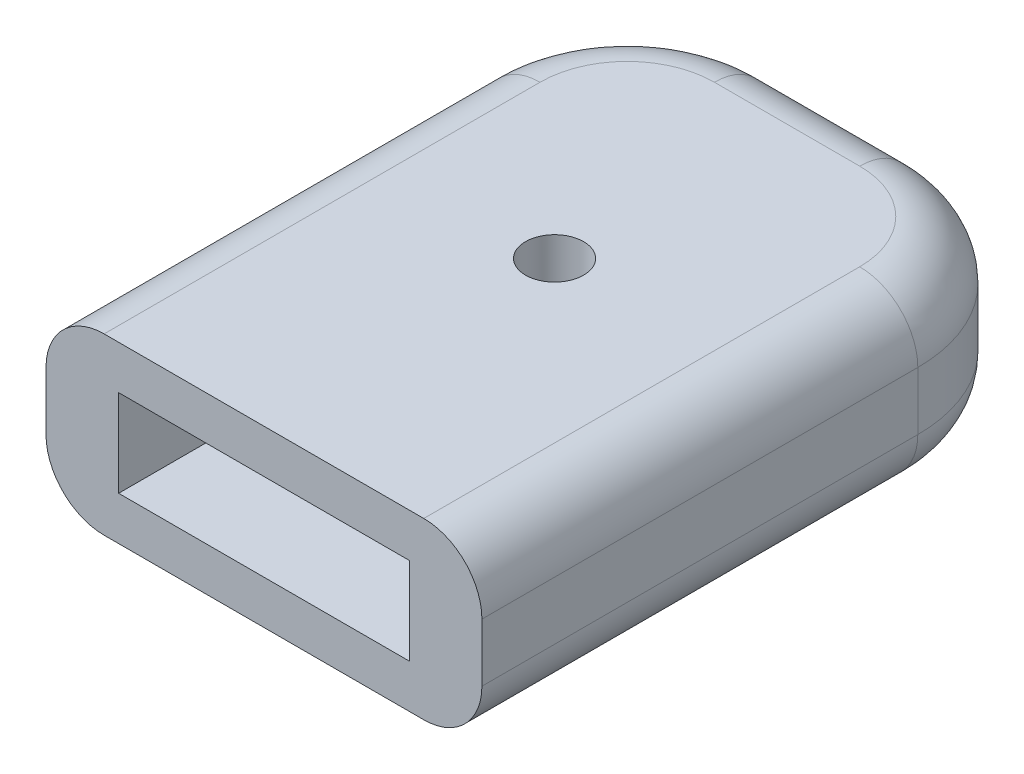
ISO-10303-21;
HEADER;
FILE_DESCRIPTION(('STEP AP214'),'2;1');
FILE_NAME('part.step','',(''),(''),'','','');
FILE_SCHEMA(('AUTOMOTIVE_DESIGN { 1 0 10303 214 1 1 1 1 }'));
ENDSEC;
DATA;
#1=APPLICATION_CONTEXT('core data for automotive mechanical design processes');
#2=APPLICATION_PROTOCOL_DEFINITION('international standard','automotive_design',2000,#1);
#3=PRODUCT_CONTEXT('',#1,'mechanical');
#4=PRODUCT('Part','Part','',(#3));
#5=PRODUCT_RELATED_PRODUCT_CATEGORY('part','',(#4));
#6=PRODUCT_DEFINITION_FORMATION('','',#4);
#7=PRODUCT_DEFINITION_CONTEXT('part definition',#1,'design');
#8=PRODUCT_DEFINITION('design','',#6,#7);
#9=PRODUCT_DEFINITION_SHAPE('','',#8);
#10=(LENGTH_UNIT() NAMED_UNIT(*) SI_UNIT(.MILLI.,.METRE.));
#11=(NAMED_UNIT(*) PLANE_ANGLE_UNIT() SI_UNIT($,.RADIAN.));
#12=(NAMED_UNIT(*) SI_UNIT($,.STERADIAN.) SOLID_ANGLE_UNIT());
#13=UNCERTAINTY_MEASURE_WITH_UNIT(LENGTH_MEASURE(1.E-05),#10,'distance_accuracy_value','');
#14=(GEOMETRIC_REPRESENTATION_CONTEXT(3) GLOBAL_UNCERTAINTY_ASSIGNED_CONTEXT((#13)) GLOBAL_UNIT_ASSIGNED_CONTEXT((#10,
#11,#12)) REPRESENTATION_CONTEXT('',''));
#15=CARTESIAN_POINT('',(0.,0.,0.));
#16=DIRECTION('',(0.,0.,1.));
#17=DIRECTION('',(1.,0.,0.));
#18=AXIS2_PLACEMENT_3D('',#15,#16,#17);
#19=CARTESIAN_POINT('',(-7.5,6.,-9.99999999999999));
#20=DIRECTION('',(1.,0.,0.));
#21=DIRECTION('',(0.,0.,-1.));
#22=AXIS2_PLACEMENT_3D('',#19,#20,#21);
#23=PLANE('',#22);
#24=DIRECTION('',(0.,-1.,0.));
#25=VECTOR('',#24,1.);
#26=CARTESIAN_POINT('',(-7.5,6.,10.));
#27=LINE('',#26,#25);
#28=CARTESIAN_POINT('',(-7.5,4.,10.));
#29=VERTEX_POINT('',#28);
#30=CARTESIAN_POINT('',(-7.5,2.,10.));
#31=VERTEX_POINT('',#30);
#32=EDGE_CURVE('E208',#29,#31,#27,.T.);
#33=ORIENTED_EDGE('',*,*,#32,.F.);
#34=DIRECTION('',(0.,0.,1.));
#35=VECTOR('',#34,1.);
#36=CARTESIAN_POINT('',(-7.5,4.,-9.99999999999999));
#37=LINE('',#36,#35);
#38=CARTESIAN_POINT('',(-7.5,4.,-4.99999999999999));
#39=VERTEX_POINT('',#38);
#40=EDGE_CURVE('E253',#29,#39,#37,.F.);
#41=ORIENTED_EDGE('',*,*,#40,.T.);
#42=DIRECTION('',(0.,-1.,0.));
#43=VECTOR('',#42,1.);
#44=CARTESIAN_POINT('',(-7.5,6.,-4.99999999999999));
#45=LINE('',#44,#43);
#46=CARTESIAN_POINT('',(-7.5,2.,-4.99999999999999));
#47=VERTEX_POINT('',#46);
#48=EDGE_CURVE('E217',#39,#47,#45,.T.);
#49=ORIENTED_EDGE('',*,*,#48,.T.);
#50=DIRECTION('',(0.,0.,1.));
#51=VECTOR('',#50,1.);
#52=CARTESIAN_POINT('',(-7.5,2.,10.));
#53=LINE('',#52,#51);
#54=EDGE_CURVE('E251',#47,#31,#53,.T.);
#55=ORIENTED_EDGE('',*,*,#54,.T.);
#56=EDGE_LOOP('',(#33,#41,#49,#55));
#57=FACE_BOUND('',#56,.T.);
#58=ADVANCED_FACE('F39',(#57),#23,.F.);
#59=CARTESIAN_POINT('',(7.5,6.,10.));
#60=DIRECTION('',(0.,0.,-1.));
#61=DIRECTION('',(-1.,0.,0.));
#62=AXIS2_PLACEMENT_3D('',#59,#60,#61);
#63=PLANE('',#62);
#64=DIRECTION('',(1.,0.,0.));
#65=VECTOR('',#64,1.);
#66=CARTESIAN_POINT('',(5.00000000000001,1.5,10.));
#67=LINE('',#66,#65);
#68=CARTESIAN_POINT('',(-4.99999999999999,1.5,10.));
#69=VERTEX_POINT('',#68);
#70=CARTESIAN_POINT('',(5.00000000000001,1.5,10.));
#71=VERTEX_POINT('',#70);
#72=EDGE_CURVE('E189',#69,#71,#67,.T.);
#73=ORIENTED_EDGE('',*,*,#72,.F.);
#74=DIRECTION('',(0.,-1.,0.));
#75=VECTOR('',#74,1.);
#76=CARTESIAN_POINT('',(-4.99999999999999,4.5,10.));
#77=LINE('',#76,#75);
#78=CARTESIAN_POINT('',(-4.99999999999999,4.5,10.));
#79=VERTEX_POINT('',#78);
#80=EDGE_CURVE('E160',#79,#69,#77,.T.);
#81=ORIENTED_EDGE('',*,*,#80,.F.);
#82=DIRECTION('',(-1.,0.,0.));
#83=VECTOR('',#82,1.);
#84=CARTESIAN_POINT('',(5.00000000000001,4.5,10.));
#85=LINE('',#84,#83);
#86=CARTESIAN_POINT('',(5.00000000000001,4.5,10.));
#87=VERTEX_POINT('',#86);
#88=EDGE_CURVE('E177',#87,#79,#85,.T.);
#89=ORIENTED_EDGE('',*,*,#88,.F.);
#90=DIRECTION('',(0.,1.,0.));
#91=VECTOR('',#90,1.);
#92=CARTESIAN_POINT('',(5.00000000000001,4.5,10.));
#93=LINE('',#92,#91);
#94=EDGE_CURVE('E180',#71,#87,#93,.T.);
#95=ORIENTED_EDGE('',*,*,#94,.F.);
#96=EDGE_LOOP('',(#73,#81,#89,#95));
#97=FACE_BOUND('',#96,.T.);
#98=DIRECTION('',(0.,-1.,0.));
#99=VECTOR('',#98,1.);
#100=CARTESIAN_POINT('',(7.5,6.,10.));
#101=LINE('',#100,#99);
#102=CARTESIAN_POINT('',(7.5,4.,10.));
#103=VERTEX_POINT('',#102);
#104=CARTESIAN_POINT('',(7.5,2.,10.));
#105=VERTEX_POINT('',#104);
#106=EDGE_CURVE('E203',#103,#105,#101,.T.);
#107=ORIENTED_EDGE('',*,*,#106,.F.);
#108=CARTESIAN_POINT('',(5.5,4.,10.));
#109=DIRECTION('',(0.,0.,-1.));
#110=DIRECTION('',(-1.,0.,0.));
#111=AXIS2_PLACEMENT_3D('',#108,#109,#110);
#112=CIRCLE('',#111,2.);
#113=CARTESIAN_POINT('',(5.5,6.,10.));
#114=VERTEX_POINT('',#113);
#115=EDGE_CURVE('E245',#103,#114,#112,.F.);
#116=ORIENTED_EDGE('',*,*,#115,.T.);
#117=DIRECTION('',(1.,0.,0.));
#118=VECTOR('',#117,1.);
#119=CARTESIAN_POINT('',(7.5,6.,10.));
#120=LINE('',#119,#118);
#121=CARTESIAN_POINT('',(-5.49999999999999,6.,10.));
#122=VERTEX_POINT('',#121);
#123=EDGE_CURVE('E200',#122,#114,#120,.T.);
#124=ORIENTED_EDGE('',*,*,#123,.F.);
#125=CARTESIAN_POINT('',(-5.5,4.,10.));
#126=DIRECTION('',(0.,0.,-1.));
#127=DIRECTION('',(-1.,0.,0.));
#128=AXIS2_PLACEMENT_3D('',#125,#126,#127);
#129=CIRCLE('',#128,2.);
#130=EDGE_CURVE('E243',#122,#29,#129,.F.);
#131=ORIENTED_EDGE('',*,*,#130,.T.);
#132=ORIENTED_EDGE('',*,*,#32,.T.);
#133=CARTESIAN_POINT('',(-5.5,2.,10.));
#134=DIRECTION('',(0.,0.,-1.));
#135=DIRECTION('',(-1.,0.,0.));
#136=AXIS2_PLACEMENT_3D('',#133,#134,#135);
#137=CIRCLE('',#136,2.);
#138=CARTESIAN_POINT('',(-5.49999999999999,0.,10.));
#139=VERTEX_POINT('',#138);
#140=EDGE_CURVE('E239',#31,#139,#137,.F.);
#141=ORIENTED_EDGE('',*,*,#140,.T.);
#142=DIRECTION('',(1.,0.,0.));
#143=VECTOR('',#142,1.);
#144=CARTESIAN_POINT('',(7.5,0.,10.));
#145=LINE('',#144,#143);
#146=CARTESIAN_POINT('',(5.5,0.,10.));
#147=VERTEX_POINT('',#146);
#148=EDGE_CURVE('E196',#139,#147,#145,.T.);
#149=ORIENTED_EDGE('',*,*,#148,.T.);
#150=CARTESIAN_POINT('',(5.5,2.,10.));
#151=DIRECTION('',(0.,0.,-1.));
#152=DIRECTION('',(-1.,0.,0.));
#153=AXIS2_PLACEMENT_3D('',#150,#151,#152);
#154=CIRCLE('',#153,2.);
#155=EDGE_CURVE('E241',#147,#105,#154,.F.);
#156=ORIENTED_EDGE('',*,*,#155,.T.);
#157=EDGE_LOOP('',(#107,#116,#124,#131,#132,#141,#149,#156));
#158=FACE_BOUND('',#157,.T.);
#159=ADVANCED_FACE('F301',(#97,#158),#63,.F.);
#160=CARTESIAN_POINT('',(7.5,6.,-9.99999999999999));
#161=DIRECTION('',(-1.,0.,0.));
#162=DIRECTION('',(0.,0.,1.));
#163=AXIS2_PLACEMENT_3D('',#160,#161,#162);
#164=PLANE('',#163);
#165=DIRECTION('',(0.,-1.,0.));
#166=VECTOR('',#165,1.);
#167=CARTESIAN_POINT('',(7.5,6.,-4.99999999999999));
#168=LINE('',#167,#166);
#169=CARTESIAN_POINT('',(7.5,2.,-4.99999999999999));
#170=VERTEX_POINT('',#169);
#171=CARTESIAN_POINT('',(7.5,4.,-4.99999999999999));
#172=VERTEX_POINT('',#171);
#173=EDGE_CURVE('E214',#170,#172,#168,.F.);
#174=ORIENTED_EDGE('',*,*,#173,.T.);
#175=DIRECTION('',(0.,0.,-1.));
#176=VECTOR('',#175,1.);
#177=CARTESIAN_POINT('',(7.5,4.,-9.99999999999999));
#178=LINE('',#177,#176);
#179=EDGE_CURVE('E237',#172,#103,#178,.F.);
#180=ORIENTED_EDGE('',*,*,#179,.T.);
#181=ORIENTED_EDGE('',*,*,#106,.T.);
#182=DIRECTION('',(0.,0.,-1.));
#183=VECTOR('',#182,1.);
#184=CARTESIAN_POINT('',(7.5,2.,-4.99999999999999));
#185=LINE('',#184,#183);
#186=EDGE_CURVE('E234',#105,#170,#185,.T.);
#187=ORIENTED_EDGE('',*,*,#186,.T.);
#188=EDGE_LOOP('',(#174,#180,#181,#187));
#189=FACE_BOUND('',#188,.T.);
#190=ADVANCED_FACE('F335',(#189),#164,.F.);
#191=CARTESIAN_POINT('',(7.5,6.,-9.99999999999999));
#192=DIRECTION('',(0.,0.,1.));
#193=DIRECTION('',(1.,0.,0.));
#194=AXIS2_PLACEMENT_3D('',#191,#192,#193);
#195=PLANE('',#194);
#196=DIRECTION('',(0.,-1.,0.));
#197=VECTOR('',#196,1.);
#198=CARTESIAN_POINT('',(-2.5,6.,-9.99999999999999));
#199=LINE('',#198,#197);
#200=CARTESIAN_POINT('',(-2.5,2.,-9.99999999999999));
#201=VERTEX_POINT('',#200);
#202=CARTESIAN_POINT('',(-2.5,4.,-9.99999999999999));
#203=VERTEX_POINT('',#202);
#204=EDGE_CURVE('E220',#201,#203,#199,.F.);
#205=ORIENTED_EDGE('',*,*,#204,.T.);
#206=DIRECTION('',(-1.,0.,0.));
#207=VECTOR('',#206,1.);
#208=CARTESIAN_POINT('',(7.5,4.,-9.99999999999999));
#209=LINE('',#208,#207);
#210=CARTESIAN_POINT('',(2.5,4.,-9.99999999999999));
#211=VERTEX_POINT('',#210);
#212=EDGE_CURVE('E11',#203,#211,#209,.F.);
#213=ORIENTED_EDGE('',*,*,#212,.T.);
#214=DIRECTION('',(0.,-1.,0.));
#215=VECTOR('',#214,1.);
#216=CARTESIAN_POINT('',(2.5,6.,-9.99999999999999));
#217=LINE('',#216,#215);
#218=CARTESIAN_POINT('',(2.5,2.,-9.99999999999999));
#219=VERTEX_POINT('',#218);
#220=EDGE_CURVE('E211',#211,#219,#217,.T.);
#221=ORIENTED_EDGE('',*,*,#220,.T.);
#222=DIRECTION('',(-1.,0.,0.));
#223=VECTOR('',#222,1.);
#224=CARTESIAN_POINT('',(-2.5,2.,-9.99999999999999));
#225=LINE('',#224,#223);
#226=EDGE_CURVE('E48',#219,#201,#225,.T.);
#227=ORIENTED_EDGE('',*,*,#226,.T.);
#228=EDGE_LOOP('',(#205,#213,#221,#227));
#229=FACE_BOUND('',#228,.T.);
#230=ADVANCED_FACE('F314',(#229),#195,.F.);
#231=CARTESIAN_POINT('',(0.,6.,0.));
#232=DIRECTION('',(0.,-1.,0.));
#233=DIRECTION('',(0.,0.,-1.));
#234=AXIS2_PLACEMENT_3D('',#231,#232,#233);
#235=PLANE('',#234);
#236=CARTESIAN_POINT('',(0.,6.,0.));
#237=DIRECTION('',(0.,-1.,0.));
#238=DIRECTION('',(0.,0.,-1.));
#239=AXIS2_PLACEMENT_3D('',#236,#237,#238);
#240=CIRCLE('',#239,1.);
#241=CARTESIAN_POINT('',(0.,6.,-1.));
#242=VERTEX_POINT('',#241);
#243=EDGE_CURVE('E183',#242,#242,#240,.T.);
#244=ORIENTED_EDGE('',*,*,#243,.T.);
#245=EDGE_LOOP('',(#244));
#246=FACE_BOUND('',#245,.T.);
#247=ORIENTED_EDGE('',*,*,#123,.T.);
#248=DIRECTION('',(0.,0.,-1.));
#249=VECTOR('',#248,1.);
#250=CARTESIAN_POINT('',(5.5,6.,0.));
#251=LINE('',#250,#249);
#252=CARTESIAN_POINT('',(5.5,6.,-4.99999999999999));
#253=VERTEX_POINT('',#252);
#254=EDGE_CURVE('E231',#114,#253,#251,.T.);
#255=ORIENTED_EDGE('',*,*,#254,.T.);
#256=CARTESIAN_POINT('',(2.5,6.,-4.99999999999999));
#257=DIRECTION('',(0.,-1.,0.));
#258=DIRECTION('',(0.,0.,-1.));
#259=AXIS2_PLACEMENT_3D('',#256,#257,#258);
#260=CIRCLE('',#259,3.);
#261=CARTESIAN_POINT('',(2.5,6.,-7.99999999999999));
#262=VERTEX_POINT('',#261);
#263=EDGE_CURVE('E229',#253,#262,#260,.F.);
#264=ORIENTED_EDGE('',*,*,#263,.T.);
#265=DIRECTION('',(-1.,0.,0.));
#266=VECTOR('',#265,1.);
#267=CARTESIAN_POINT('',(0.,6.,-7.99999999999999));
#268=LINE('',#267,#266);
#269=CARTESIAN_POINT('',(-2.5,6.,-7.99999999999999));
#270=VERTEX_POINT('',#269);
#271=EDGE_CURVE('E223',#262,#270,#268,.T.);
#272=ORIENTED_EDGE('',*,*,#271,.T.);
#273=CARTESIAN_POINT('',(-2.5,6.,-4.99999999999999));
#274=DIRECTION('',(0.,-1.,0.));
#275=DIRECTION('',(0.,0.,-1.));
#276=AXIS2_PLACEMENT_3D('',#273,#274,#275);
#277=CIRCLE('',#276,3.);
#278=CARTESIAN_POINT('',(-5.5,6.,-4.99999999999999));
#279=VERTEX_POINT('',#278);
#280=EDGE_CURVE('E225',#270,#279,#277,.F.);
#281=ORIENTED_EDGE('',*,*,#280,.T.);
#282=DIRECTION('',(0.,0.,1.));
#283=VECTOR('',#282,1.);
#284=CARTESIAN_POINT('',(-5.5,6.,0.));
#285=LINE('',#284,#283);
#286=EDGE_CURVE('E227',#279,#122,#285,.T.);
#287=ORIENTED_EDGE('',*,*,#286,.T.);
#288=EDGE_LOOP('',(#247,#255,#264,#272,#281,#287));
#289=FACE_BOUND('',#288,.T.);
#290=ADVANCED_FACE('F342',(#246,#289),#235,.F.);
#291=CARTESIAN_POINT('',(0.,0.,0.));
#292=DIRECTION('',(0.,-1.,0.));
#293=DIRECTION('',(0.,0.,-1.));
#294=AXIS2_PLACEMENT_3D('',#291,#292,#293);
#295=PLANE('',#294);
#296=CARTESIAN_POINT('',(0.,0.,0.));
#297=DIRECTION('',(0.,-1.,0.));
#298=DIRECTION('',(0.,0.,-1.));
#299=AXIS2_PLACEMENT_3D('',#296,#297,#298);
#300=CIRCLE('',#299,1.);
#301=CARTESIAN_POINT('',(0.,0.,-1.));
#302=VERTEX_POINT('',#301);
#303=EDGE_CURVE('E624',#302,#302,#300,.T.);
#304=ORIENTED_EDGE('',*,*,#303,.F.);
#305=EDGE_LOOP('',(#304));
#306=FACE_BOUND('',#305,.T.);
#307=CARTESIAN_POINT('',(2.5,0.,-4.99999999999999));
#308=DIRECTION('',(0.,-1.,0.));
#309=DIRECTION('',(0.,0.,-1.));
#310=AXIS2_PLACEMENT_3D('',#307,#308,#309);
#311=CIRCLE('',#310,3.);
#312=CARTESIAN_POINT('',(2.5,0.,-7.99999999999999));
#313=VERTEX_POINT('',#312);
#314=CARTESIAN_POINT('',(5.5,0.,-4.99999999999999));
#315=VERTEX_POINT('',#314);
#316=EDGE_CURVE('E56',#313,#315,#311,.T.);
#317=ORIENTED_EDGE('',*,*,#316,.T.);
#318=DIRECTION('',(0.,0.,-1.));
#319=VECTOR('',#318,1.);
#320=CARTESIAN_POINT('',(5.5,0.,10.));
#321=LINE('',#320,#319);
#322=EDGE_CURVE('E265',#315,#147,#321,.F.);
#323=ORIENTED_EDGE('',*,*,#322,.T.);
#324=ORIENTED_EDGE('',*,*,#148,.F.);
#325=DIRECTION('',(0.,0.,1.));
#326=VECTOR('',#325,1.);
#327=CARTESIAN_POINT('',(-5.5,0.,-4.99999999999999));
#328=LINE('',#327,#326);
#329=CARTESIAN_POINT('',(-5.5,0.,-4.99999999999999));
#330=VERTEX_POINT('',#329);
#331=EDGE_CURVE('E63',#139,#330,#328,.F.);
#332=ORIENTED_EDGE('',*,*,#331,.T.);
#333=CARTESIAN_POINT('',(-2.5,0.,-4.99999999999999));
#334=DIRECTION('',(0.,-1.,0.));
#335=DIRECTION('',(0.,0.,-1.));
#336=AXIS2_PLACEMENT_3D('',#333,#334,#335);
#337=CIRCLE('',#336,3.);
#338=CARTESIAN_POINT('',(-2.5,0.,-7.99999999999999));
#339=VERTEX_POINT('',#338);
#340=EDGE_CURVE('E261',#330,#339,#337,.T.);
#341=ORIENTED_EDGE('',*,*,#340,.T.);
#342=DIRECTION('',(-1.,0.,0.));
#343=VECTOR('',#342,1.);
#344=CARTESIAN_POINT('',(2.5,0.,-7.99999999999999));
#345=LINE('',#344,#343);
#346=EDGE_CURVE('E259',#339,#313,#345,.F.);
#347=ORIENTED_EDGE('',*,*,#346,.T.);
#348=EDGE_LOOP('',(#317,#323,#324,#332,#341,#347));
#349=FACE_BOUND('',#348,.T.);
#350=ADVANCED_FACE('F344',(#306,#349),#295,.T.);
#351=CARTESIAN_POINT('',(-4.99999999999999,4.5,-5.99999999999999));
#352=DIRECTION('',(-1.,0.,0.));
#353=DIRECTION('',(0.,-1.,0.));
#354=AXIS2_PLACEMENT_3D('',#351,#352,#353);
#355=PLANE('',#354);
#356=ORIENTED_EDGE('',*,*,#80,.T.);
#357=DIRECTION('',(0.,0.,1.));
#358=VECTOR('',#357,1.);
#359=CARTESIAN_POINT('',(-4.99999999999999,1.5,-5.99999999999999));
#360=LINE('',#359,#358);
#361=CARTESIAN_POINT('',(-4.99999999999999,1.5,-5.99999999999999));
#362=VERTEX_POINT('',#361);
#363=EDGE_CURVE('E153',#362,#69,#360,.T.);
#364=ORIENTED_EDGE('',*,*,#363,.F.);
#365=DIRECTION('',(0.,-1.,0.));
#366=VECTOR('',#365,1.);
#367=CARTESIAN_POINT('',(-4.99999999999999,4.5,-5.99999999999999));
#368=LINE('',#367,#366);
#369=CARTESIAN_POINT('',(-4.99999999999999,4.5,-5.99999999999999));
#370=VERTEX_POINT('',#369);
#371=EDGE_CURVE('E157',#370,#362,#368,.T.);
#372=ORIENTED_EDGE('',*,*,#371,.F.);
#373=DIRECTION('',(0.,0.,1.));
#374=VECTOR('',#373,1.);
#375=CARTESIAN_POINT('',(-4.99999999999999,4.5,-5.99999999999999));
#376=LINE('',#375,#374);
#377=EDGE_CURVE('E194',#370,#79,#376,.T.);
#378=ORIENTED_EDGE('',*,*,#377,.T.);
#379=EDGE_LOOP('',(#356,#364,#372,#378));
#380=FACE_BOUND('',#379,.T.);
#381=ADVANCED_FACE('F155',(#380),#355,.F.);
#382=CARTESIAN_POINT('',(5.00000000000001,4.5,-5.99999999999999));
#383=DIRECTION('',(0.,1.,0.));
#384=DIRECTION('',(-1.,0.,0.));
#385=AXIS2_PLACEMENT_3D('',#382,#383,#384);
#386=PLANE('',#385);
#387=CARTESIAN_POINT('',(0.,4.5,0.));
#388=DIRECTION('',(0.,1.,0.));
#389=DIRECTION('',(-1.,0.,0.));
#390=AXIS2_PLACEMENT_3D('',#387,#388,#389);
#391=CIRCLE('',#390,1.);
#392=CARTESIAN_POINT('',(-1.,4.5,0.));
#393=VERTEX_POINT('',#392);
#394=EDGE_CURVE('E621',#393,#393,#391,.T.);
#395=ORIENTED_EDGE('',*,*,#394,.T.);
#396=EDGE_LOOP('',(#395));
#397=FACE_BOUND('',#396,.T.);
#398=ORIENTED_EDGE('',*,*,#88,.T.);
#399=ORIENTED_EDGE('',*,*,#377,.F.);
#400=DIRECTION('',(-1.,0.,0.));
#401=VECTOR('',#400,1.);
#402=CARTESIAN_POINT('',(5.00000000000001,4.5,-5.99999999999999));
#403=LINE('',#402,#401);
#404=CARTESIAN_POINT('',(5.00000000000001,4.5,-5.99999999999999));
#405=VERTEX_POINT('',#404);
#406=EDGE_CURVE('E165',#405,#370,#403,.T.);
#407=ORIENTED_EDGE('',*,*,#406,.F.);
#408=DIRECTION('',(0.,0.,1.));
#409=VECTOR('',#408,1.);
#410=CARTESIAN_POINT('',(5.00000000000001,4.5,-5.99999999999999));
#411=LINE('',#410,#409);
#412=EDGE_CURVE('E197',#405,#87,#411,.T.);
#413=ORIENTED_EDGE('',*,*,#412,.T.);
#414=EDGE_LOOP('',(#398,#399,#407,#413));
#415=FACE_BOUND('',#414,.T.);
#416=ADVANCED_FACE('F453',(#397,#415),#386,.F.);
#417=CARTESIAN_POINT('',(5.00000000000001,4.5,-5.99999999999999));
#418=DIRECTION('',(1.,0.,0.));
#419=DIRECTION('',(0.,0.,-1.));
#420=AXIS2_PLACEMENT_3D('',#417,#418,#419);
#421=PLANE('',#420);
#422=ORIENTED_EDGE('',*,*,#94,.T.);
#423=ORIENTED_EDGE('',*,*,#412,.F.);
#424=DIRECTION('',(0.,1.,0.));
#425=VECTOR('',#424,1.);
#426=CARTESIAN_POINT('',(5.00000000000001,4.5,-5.99999999999999));
#427=LINE('',#426,#425);
#428=CARTESIAN_POINT('',(5.00000000000001,1.5,-5.99999999999999));
#429=VERTEX_POINT('',#428);
#430=EDGE_CURVE('E173',#429,#405,#427,.T.);
#431=ORIENTED_EDGE('',*,*,#430,.F.);
#432=DIRECTION('',(0.,0.,1.));
#433=VECTOR('',#432,1.);
#434=CARTESIAN_POINT('',(5.00000000000001,1.5,-5.99999999999999));
#435=LINE('',#434,#433);
#436=EDGE_CURVE('E164',#429,#71,#435,.T.);
#437=ORIENTED_EDGE('',*,*,#436,.T.);
#438=EDGE_LOOP('',(#422,#423,#431,#437));
#439=FACE_BOUND('',#438,.T.);
#440=ADVANCED_FACE('F441',(#439),#421,.F.);
#441=CARTESIAN_POINT('',(5.00000000000001,1.5,-5.99999999999999));
#442=DIRECTION('',(0.,-1.,0.));
#443=DIRECTION('',(1.,0.,0.));
#444=AXIS2_PLACEMENT_3D('',#441,#442,#443);
#445=PLANE('',#444);
#446=CARTESIAN_POINT('',(0.,1.5,0.));
#447=DIRECTION('',(0.,-1.,0.));
#448=DIRECTION('',(1.,0.,0.));
#449=AXIS2_PLACEMENT_3D('',#446,#447,#448);
#450=CIRCLE('',#449,1.);
#451=CARTESIAN_POINT('',(1.,1.5,0.));
#452=VERTEX_POINT('',#451);
#453=EDGE_CURVE('E43',#452,#452,#450,.T.);
#454=ORIENTED_EDGE('',*,*,#453,.T.);
#455=EDGE_LOOP('',(#454));
#456=FACE_BOUND('',#455,.T.);
#457=ORIENTED_EDGE('',*,*,#72,.T.);
#458=ORIENTED_EDGE('',*,*,#436,.F.);
#459=DIRECTION('',(1.,0.,0.));
#460=VECTOR('',#459,1.);
#461=CARTESIAN_POINT('',(5.00000000000001,1.5,-5.99999999999999));
#462=LINE('',#461,#460);
#463=EDGE_CURVE('E168',#362,#429,#462,.T.);
#464=ORIENTED_EDGE('',*,*,#463,.F.);
#465=ORIENTED_EDGE('',*,*,#363,.T.);
#466=EDGE_LOOP('',(#457,#458,#464,#465));
#467=FACE_BOUND('',#466,.T.);
#468=ADVANCED_FACE('F169',(#456,#467),#445,.F.);
#469=CARTESIAN_POINT('',(0.,0.,-5.99999999999999));
#470=DIRECTION('',(0.,0.,-1.));
#471=DIRECTION('',(-1.,0.,0.));
#472=AXIS2_PLACEMENT_3D('',#469,#470,#471);
#473=PLANE('',#472);
#474=ORIENTED_EDGE('',*,*,#371,.T.);
#475=ORIENTED_EDGE('',*,*,#463,.T.);
#476=ORIENTED_EDGE('',*,*,#430,.T.);
#477=ORIENTED_EDGE('',*,*,#406,.T.);
#478=EDGE_LOOP('',(#474,#475,#476,#477));
#479=FACE_BOUND('',#478,.T.);
#480=ADVANCED_FACE('F175',(#479),#473,.F.);
#481=CARTESIAN_POINT('',(2.5,6.,-4.99999999999999));
#482=DIRECTION('',(0.,-1.,0.));
#483=DIRECTION('',(0.,0.,-1.));
#484=AXIS2_PLACEMENT_3D('',#481,#482,#483);
#485=CYLINDRICAL_SURFACE('',#484,5.);
#486=ORIENTED_EDGE('',*,*,#220,.F.);
#487=CARTESIAN_POINT('',(2.5,4.,-4.99999999999999));
#488=DIRECTION('',(0.,-1.,0.));
#489=DIRECTION('',(0.,0.,-1.));
#490=AXIS2_PLACEMENT_3D('',#487,#488,#489);
#491=CIRCLE('',#490,5.);
#492=EDGE_CURVE('E249',#211,#172,#491,.T.);
#493=ORIENTED_EDGE('',*,*,#492,.T.);
#494=ORIENTED_EDGE('',*,*,#173,.F.);
#495=CARTESIAN_POINT('',(2.5,2.,-4.99999999999999));
#496=DIRECTION('',(0.,-1.,0.));
#497=DIRECTION('',(0.,0.,-1.));
#498=AXIS2_PLACEMENT_3D('',#495,#496,#497);
#499=CIRCLE('',#498,5.);
#500=EDGE_CURVE('E247',#170,#219,#499,.F.);
#501=ORIENTED_EDGE('',*,*,#500,.T.);
#502=EDGE_LOOP('',(#486,#493,#494,#501));
#503=FACE_BOUND('',#502,.T.);
#504=ADVANCED_FACE('F332',(#503),#485,.T.);
#505=CARTESIAN_POINT('',(-2.5,6.,-4.99999999999999));
#506=DIRECTION('',(0.,-1.,0.));
#507=DIRECTION('',(0.,0.,-1.));
#508=AXIS2_PLACEMENT_3D('',#505,#506,#507);
#509=CYLINDRICAL_SURFACE('',#508,5.);
#510=ORIENTED_EDGE('',*,*,#48,.F.);
#511=CARTESIAN_POINT('',(-2.5,4.,-4.99999999999999));
#512=DIRECTION('',(0.,-1.,0.));
#513=DIRECTION('',(0.,0.,-1.));
#514=AXIS2_PLACEMENT_3D('',#511,#512,#513);
#515=CIRCLE('',#514,5.);
#516=EDGE_CURVE('E257',#39,#203,#515,.T.);
#517=ORIENTED_EDGE('',*,*,#516,.T.);
#518=ORIENTED_EDGE('',*,*,#204,.F.);
#519=CARTESIAN_POINT('',(-2.5,2.,-4.99999999999999));
#520=DIRECTION('',(0.,-1.,0.));
#521=DIRECTION('',(0.,0.,-1.));
#522=AXIS2_PLACEMENT_3D('',#519,#520,#521);
#523=CIRCLE('',#522,5.);
#524=EDGE_CURVE('E255',#201,#47,#523,.F.);
#525=ORIENTED_EDGE('',*,*,#524,.T.);
#526=EDGE_LOOP('',(#510,#517,#518,#525));
#527=FACE_BOUND('',#526,.T.);
#528=ADVANCED_FACE('F310',(#527),#509,.T.);
#529=CARTESIAN_POINT('',(-5.5,4.,0.));
#530=DIRECTION('',(0.,0.,1.));
#531=DIRECTION('',(1.,0.,0.));
#532=AXIS2_PLACEMENT_3D('',#529,#530,#531);
#533=CYLINDRICAL_SURFACE('',#532,2.);
#534=ORIENTED_EDGE('',*,*,#130,.F.);
#535=ORIENTED_EDGE('',*,*,#286,.F.);
#536=CARTESIAN_POINT('',(-5.5,4.,-4.99999999999999));
#537=DIRECTION('',(0.,0.,-1.));
#538=DIRECTION('',(-1.,0.,0.));
#539=AXIS2_PLACEMENT_3D('',#536,#537,#538);
#540=CIRCLE('',#539,2.);
#541=EDGE_CURVE('E190',#39,#279,#540,.T.);
#542=ORIENTED_EDGE('',*,*,#541,.F.);
#543=ORIENTED_EDGE('',*,*,#40,.F.);
#544=EDGE_LOOP('',(#534,#535,#542,#543));
#545=FACE_BOUND('',#544,.T.);
#546=ADVANCED_FACE('F306',(#545),#533,.T.);
#547=CARTESIAN_POINT('',(-2.5,4.,-4.99999999999999));
#548=DIRECTION('',(0.,-1.,0.));
#549=DIRECTION('',(0.,0.,-1.));
#550=AXIS2_PLACEMENT_3D('',#547,#548,#549);
#551=TOROIDAL_SURFACE('',#550,3.,2.);
#552=ORIENTED_EDGE('',*,*,#541,.T.);
#553=ORIENTED_EDGE('',*,*,#280,.F.);
#554=CARTESIAN_POINT('',(-2.5,4.,-7.99999999999999));
#555=DIRECTION('',(1.,0.,0.));
#556=DIRECTION('',(0.,0.,-1.));
#557=AXIS2_PLACEMENT_3D('',#554,#555,#556);
#558=CIRCLE('',#557,2.);
#559=EDGE_CURVE('E274',#203,#270,#558,.T.);
#560=ORIENTED_EDGE('',*,*,#559,.F.);
#561=ORIENTED_EDGE('',*,*,#516,.F.);
#562=EDGE_LOOP('',(#552,#553,#560,#561));
#563=FACE_BOUND('',#562,.T.);
#564=ADVANCED_FACE('F320',(#563),#551,.T.);
#565=CARTESIAN_POINT('',(0.,4.,-7.99999999999999));
#566=DIRECTION('',(-1.,0.,0.));
#567=DIRECTION('',(0.,0.,1.));
#568=AXIS2_PLACEMENT_3D('',#565,#566,#567);
#569=CYLINDRICAL_SURFACE('',#568,2.);
#570=ORIENTED_EDGE('',*,*,#559,.T.);
#571=ORIENTED_EDGE('',*,*,#271,.F.);
#572=CARTESIAN_POINT('',(2.5,4.,-7.99999999999999));
#573=DIRECTION('',(1.,0.,0.));
#574=DIRECTION('',(0.,0.,-1.));
#575=AXIS2_PLACEMENT_3D('',#572,#573,#574);
#576=CIRCLE('',#575,2.);
#577=EDGE_CURVE('E270',#211,#262,#576,.T.);
#578=ORIENTED_EDGE('',*,*,#577,.F.);
#579=ORIENTED_EDGE('',*,*,#212,.F.);
#580=EDGE_LOOP('',(#570,#571,#578,#579));
#581=FACE_BOUND('',#580,.T.);
#582=ADVANCED_FACE('F324',(#581),#569,.T.);
#583=CARTESIAN_POINT('',(2.5,4.,-4.99999999999999));
#584=DIRECTION('',(0.,-1.,0.));
#585=DIRECTION('',(0.,0.,-1.));
#586=AXIS2_PLACEMENT_3D('',#583,#584,#585);
#587=TOROIDAL_SURFACE('',#586,3.,2.);
#588=ORIENTED_EDGE('',*,*,#577,.T.);
#589=ORIENTED_EDGE('',*,*,#263,.F.);
#590=CARTESIAN_POINT('',(5.5,4.,-4.99999999999999));
#591=DIRECTION('',(0.,0.,1.));
#592=DIRECTION('',(1.,0.,0.));
#593=AXIS2_PLACEMENT_3D('',#590,#591,#592);
#594=CIRCLE('',#593,2.);
#595=EDGE_CURVE('E268',#172,#253,#594,.T.);
#596=ORIENTED_EDGE('',*,*,#595,.F.);
#597=ORIENTED_EDGE('',*,*,#492,.F.);
#598=EDGE_LOOP('',(#588,#589,#596,#597));
#599=FACE_BOUND('',#598,.T.);
#600=ADVANCED_FACE('F329',(#599),#587,.T.);
#601=CARTESIAN_POINT('',(5.5,4.,0.));
#602=DIRECTION('',(0.,0.,-1.));
#603=DIRECTION('',(-1.,0.,0.));
#604=AXIS2_PLACEMENT_3D('',#601,#602,#603);
#605=CYLINDRICAL_SURFACE('',#604,2.);
#606=ORIENTED_EDGE('',*,*,#115,.F.);
#607=ORIENTED_EDGE('',*,*,#179,.F.);
#608=ORIENTED_EDGE('',*,*,#595,.T.);
#609=ORIENTED_EDGE('',*,*,#254,.F.);
#610=EDGE_LOOP('',(#606,#607,#608,#609));
#611=FACE_BOUND('',#610,.T.);
#612=ADVANCED_FACE('F339',(#611),#605,.T.);
#613=CARTESIAN_POINT('',(-5.5,2.,-9.99999999999999));
#614=DIRECTION('',(0.,0.,-1.));
#615=DIRECTION('',(-1.,0.,0.));
#616=AXIS2_PLACEMENT_3D('',#613,#614,#615);
#617=CYLINDRICAL_SURFACE('',#616,2.);
#618=ORIENTED_EDGE('',*,*,#140,.F.);
#619=ORIENTED_EDGE('',*,*,#54,.F.);
#620=CARTESIAN_POINT('',(-5.5,2.,-4.99999999999999));
#621=DIRECTION('',(0.,0.,-1.));
#622=DIRECTION('',(-1.,0.,0.));
#623=AXIS2_PLACEMENT_3D('',#620,#621,#622);
#624=CIRCLE('',#623,2.);
#625=EDGE_CURVE('E271',#330,#47,#624,.T.);
#626=ORIENTED_EDGE('',*,*,#625,.F.);
#627=ORIENTED_EDGE('',*,*,#331,.F.);
#628=EDGE_LOOP('',(#618,#619,#626,#627));
#629=FACE_BOUND('',#628,.T.);
#630=ADVANCED_FACE('F41',(#629),#617,.T.);
#631=CARTESIAN_POINT('',(-2.5,2.,-4.99999999999999));
#632=DIRECTION('',(0.,-1.,0.));
#633=DIRECTION('',(0.,0.,-1.));
#634=AXIS2_PLACEMENT_3D('',#631,#632,#633);
#635=TOROIDAL_SURFACE('',#634,3.,2.);
#636=ORIENTED_EDGE('',*,*,#625,.T.);
#637=ORIENTED_EDGE('',*,*,#524,.F.);
#638=CARTESIAN_POINT('',(-2.5,2.,-7.99999999999999));
#639=DIRECTION('',(1.,0.,0.));
#640=DIRECTION('',(0.,0.,-1.));
#641=AXIS2_PLACEMENT_3D('',#638,#639,#640);
#642=CIRCLE('',#641,2.);
#643=EDGE_CURVE('E284',#339,#201,#642,.T.);
#644=ORIENTED_EDGE('',*,*,#643,.F.);
#645=ORIENTED_EDGE('',*,*,#340,.F.);
#646=EDGE_LOOP('',(#636,#637,#644,#645));
#647=FACE_BOUND('',#646,.T.);
#648=ADVANCED_FACE('F290',(#647),#635,.T.);
#649=CARTESIAN_POINT('',(7.5,2.,-7.99999999999999));
#650=DIRECTION('',(1.,0.,0.));
#651=DIRECTION('',(0.,0.,-1.));
#652=AXIS2_PLACEMENT_3D('',#649,#650,#651);
#653=CYLINDRICAL_SURFACE('',#652,2.);
#654=ORIENTED_EDGE('',*,*,#643,.T.);
#655=ORIENTED_EDGE('',*,*,#226,.F.);
#656=CARTESIAN_POINT('',(2.5,2.,-7.99999999999999));
#657=DIRECTION('',(1.,0.,0.));
#658=DIRECTION('',(0.,0.,-1.));
#659=AXIS2_PLACEMENT_3D('',#656,#657,#658);
#660=CIRCLE('',#659,2.);
#661=EDGE_CURVE('E281',#313,#219,#660,.T.);
#662=ORIENTED_EDGE('',*,*,#661,.F.);
#663=ORIENTED_EDGE('',*,*,#346,.F.);
#664=EDGE_LOOP('',(#654,#655,#662,#663));
#665=FACE_BOUND('',#664,.T.);
#666=ADVANCED_FACE('F388',(#665),#653,.T.);
#667=CARTESIAN_POINT('',(2.5,2.,-4.99999999999999));
#668=DIRECTION('',(0.,-1.,0.));
#669=DIRECTION('',(0.,0.,-1.));
#670=AXIS2_PLACEMENT_3D('',#667,#668,#669);
#671=TOROIDAL_SURFACE('',#670,3.,2.);
#672=ORIENTED_EDGE('',*,*,#661,.T.);
#673=ORIENTED_EDGE('',*,*,#500,.F.);
#674=CARTESIAN_POINT('',(5.5,2.,-4.99999999999999));
#675=DIRECTION('',(0.,0.,1.));
#676=DIRECTION('',(1.,0.,0.));
#677=AXIS2_PLACEMENT_3D('',#674,#675,#676);
#678=CIRCLE('',#677,2.);
#679=EDGE_CURVE('E279',#315,#170,#678,.T.);
#680=ORIENTED_EDGE('',*,*,#679,.F.);
#681=ORIENTED_EDGE('',*,*,#316,.F.);
#682=EDGE_LOOP('',(#672,#673,#680,#681));
#683=FACE_BOUND('',#682,.T.);
#684=ADVANCED_FACE('F384',(#683),#671,.T.);
#685=CARTESIAN_POINT('',(5.5,2.,-9.99999999999999));
#686=DIRECTION('',(0.,0.,1.));
#687=DIRECTION('',(1.,0.,0.));
#688=AXIS2_PLACEMENT_3D('',#685,#686,#687);
#689=CYLINDRICAL_SURFACE('',#688,2.);
#690=ORIENTED_EDGE('',*,*,#155,.F.);
#691=ORIENTED_EDGE('',*,*,#322,.F.);
#692=ORIENTED_EDGE('',*,*,#679,.T.);
#693=ORIENTED_EDGE('',*,*,#186,.F.);
#694=EDGE_LOOP('',(#690,#691,#692,#693));
#695=FACE_BOUND('',#694,.T.);
#696=ADVANCED_FACE('F380',(#695),#689,.T.);
#697=CARTESIAN_POINT('',(0.,16.,0.));
#698=DIRECTION('',(0.,-1.,0.));
#699=DIRECTION('',(0.,0.,-1.));
#700=AXIS2_PLACEMENT_3D('',#697,#698,#699);
#701=CYLINDRICAL_SURFACE('',#700,1.);
#702=ORIENTED_EDGE('',*,*,#303,.T.);
#703=EDGE_LOOP('',(#702));
#704=FACE_BOUND('',#703,.T.);
#705=ORIENTED_EDGE('',*,*,#453,.F.);
#706=EDGE_LOOP('',(#705));
#707=FACE_BOUND('',#706,.T.);
#708=ADVANCED_FACE('F383',(#704,#707),#701,.F.);
#709=ORIENTED_EDGE('',*,*,#394,.F.);
#710=EDGE_LOOP('',(#709));
#711=FACE_BOUND('',#710,.T.);
#712=ORIENTED_EDGE('',*,*,#243,.F.);
#713=EDGE_LOOP('',(#712));
#714=FACE_BOUND('',#713,.T.);
#715=ADVANCED_FACE('F595',(#711,#714),#701,.F.);
#716=CLOSED_SHELL('',(#58,#159,#190,#230,#290,#350,#381,#416,#440,#468,#480,#504,#528,#546,#564,
#582,#600,#612,#630,#648,#666,#684,#696,#708,#715));
#717=MANIFOLD_SOLID_BREP('B2',#716);
#718=ADVANCED_BREP_SHAPE_REPRESENTATION('',(#18,#717),#14);
#719=SHAPE_DEFINITION_REPRESENTATION(#9,#718);
ENDSEC;
END-ISO-10303-21;
